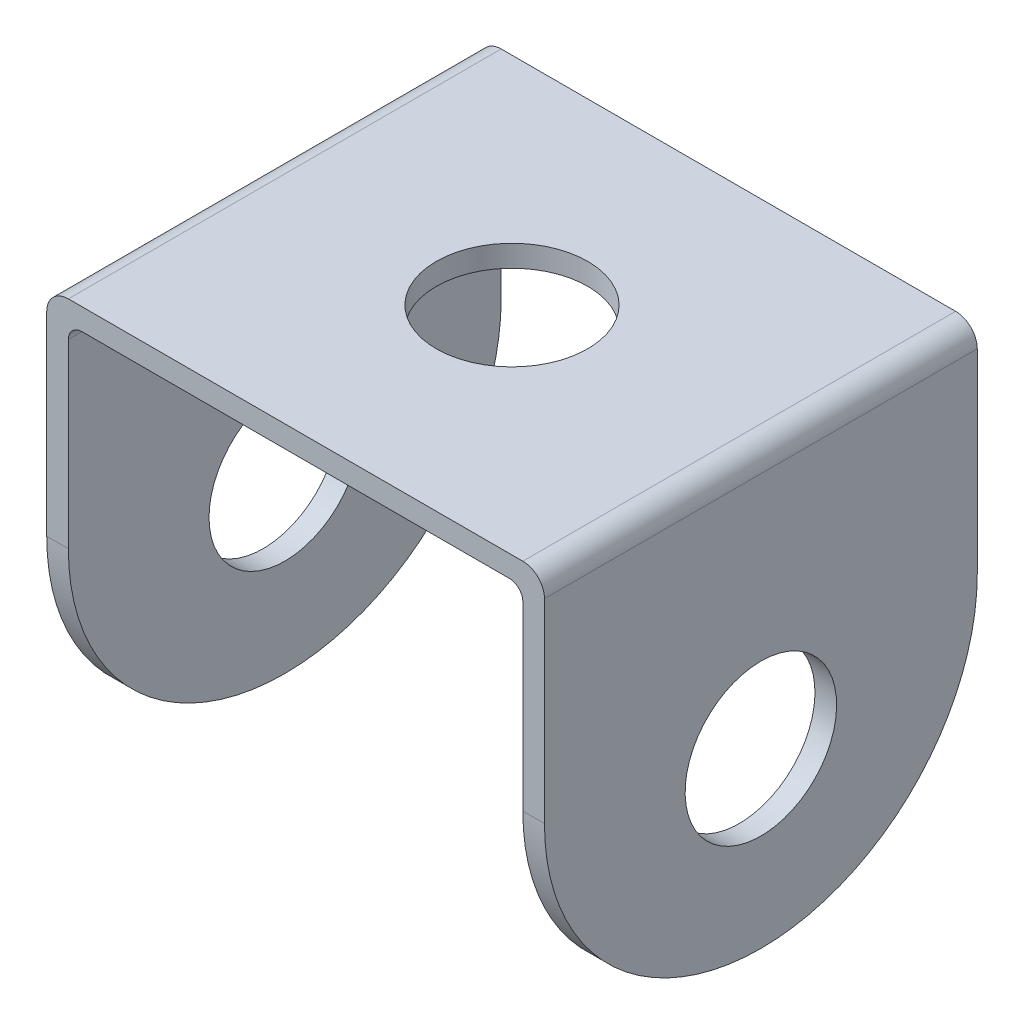
ISO-10303-21;
HEADER;
FILE_DESCRIPTION(('STEP AP214'),'2;1');
FILE_NAME('part.step','',(''),(''),'','','');
FILE_SCHEMA(('AUTOMOTIVE_DESIGN { 1 0 10303 214 1 1 1 1 }'));
ENDSEC;
DATA;
#1=APPLICATION_CONTEXT('core data for automotive mechanical design processes');
#2=APPLICATION_PROTOCOL_DEFINITION('international standard','automotive_design',2000,#1);
#3=PRODUCT_CONTEXT('',#1,'mechanical');
#4=PRODUCT('Part','Part','',(#3));
#5=PRODUCT_RELATED_PRODUCT_CATEGORY('part','',(#4));
#6=PRODUCT_DEFINITION_FORMATION('','',#4);
#7=PRODUCT_DEFINITION_CONTEXT('part definition',#1,'design');
#8=PRODUCT_DEFINITION('design','',#6,#7);
#9=PRODUCT_DEFINITION_SHAPE('','',#8);
#10=(LENGTH_UNIT() NAMED_UNIT(*) SI_UNIT(.MILLI.,.METRE.));
#11=(NAMED_UNIT(*) PLANE_ANGLE_UNIT() SI_UNIT($,.RADIAN.));
#12=(NAMED_UNIT(*) SI_UNIT($,.STERADIAN.) SOLID_ANGLE_UNIT());
#13=UNCERTAINTY_MEASURE_WITH_UNIT(LENGTH_MEASURE(1.E-05),#10,'distance_accuracy_value','');
#14=(GEOMETRIC_REPRESENTATION_CONTEXT(3) GLOBAL_UNCERTAINTY_ASSIGNED_CONTEXT((#13)) GLOBAL_UNIT_ASSIGNED_CONTEXT((#10,
#11,#12)) REPRESENTATION_CONTEXT('',''));
#15=CARTESIAN_POINT('',(0.,0.,0.));
#16=DIRECTION('',(0.,0.,1.));
#17=DIRECTION('',(1.,0.,0.));
#18=AXIS2_PLACEMENT_3D('',#15,#16,#17);
#19=CARTESIAN_POINT('',(20.3073,15.24,6.34999999999999));
#20=DIRECTION('',(0.,-1.,0.));
#21=DIRECTION('',(-1.,0.,0.));
#22=AXIS2_PLACEMENT_3D('',#19,#20,#21);
#23=CYLINDRICAL_SURFACE('',#22,2.2225);
#24=CARTESIAN_POINT('',(20.3073,14.605,6.34999999999999));
#25=DIRECTION('',(0.,1.,0.));
#26=DIRECTION('',(1.,0.,0.));
#27=AXIS2_PLACEMENT_3D('',#24,#25,#26);
#28=CIRCLE('',#27,2.2225);
#29=CARTESIAN_POINT('',(18.0848,14.605,6.34999999999999));
#30=VERTEX_POINT('',#29);
#31=EDGE_CURVE('E217',#30,#30,#28,.T.);
#32=CARTESIAN_POINT('',(20.3073,15.24,6.34999999999999));
#33=DIRECTION('',(0.,-1.,0.));
#34=DIRECTION('',(-1.,0.,0.));
#35=AXIS2_PLACEMENT_3D('',#32,#33,#34);
#36=CIRCLE('',#35,2.2225);
#37=CARTESIAN_POINT('',(18.0848,15.24,6.34999999999999));
#38=VERTEX_POINT('',#37);
#39=EDGE_CURVE('E142',#38,#38,#36,.T.);
#40=CARTESIAN_POINT('',(18.0848,14.605,6.34999999999999));
#41=CARTESIAN_POINT('',(18.0848,14.6116145833334,6.34999999999999));
#42=CARTESIAN_POINT('',(18.0848,14.6182291666667,6.34999999999999));
#43=CARTESIAN_POINT('',(18.0848,14.6314583333334,6.34999999999999));
#44=CARTESIAN_POINT('',(18.0848,14.6380729166667,6.34999999999999));
#45=CARTESIAN_POINT('',(18.0848,14.6513020833334,6.34999999999999));
#46=CARTESIAN_POINT('',(18.0848,14.6579166666667,6.34999999999999));
#47=CARTESIAN_POINT('',(18.0848,14.6711458333334,6.34999999999999));
#48=CARTESIAN_POINT('',(18.0848,14.6777604166667,6.34999999999999));
#49=CARTESIAN_POINT('',(18.0848,14.6909895833334,6.34999999999999));
#50=CARTESIAN_POINT('',(18.0848,14.6976041666667,6.34999999999999));
#51=CARTESIAN_POINT('',(18.0848,14.7108333333334,6.34999999999999));
#52=CARTESIAN_POINT('',(18.0848,14.7174479166667,6.34999999999999));
#53=CARTESIAN_POINT('',(18.0848,14.7306770833334,6.34999999999999));
#54=CARTESIAN_POINT('',(18.0848,14.7372916666667,6.34999999999999));
#55=CARTESIAN_POINT('',(18.0848,14.7505208333334,6.34999999999999));
#56=CARTESIAN_POINT('',(18.0848,14.7571354166667,6.34999999999999));
#57=CARTESIAN_POINT('',(18.0848,14.7703645833334,6.34999999999999));
#58=CARTESIAN_POINT('',(18.0848,14.7769791666667,6.34999999999999));
#59=CARTESIAN_POINT('',(18.0848,14.7902083333334,6.34999999999999));
#60=CARTESIAN_POINT('',(18.0848,14.7968229166667,6.34999999999999));
#61=CARTESIAN_POINT('',(18.0848,14.8100520833334,6.34999999999999));
#62=CARTESIAN_POINT('',(18.0848,14.8166666666667,6.34999999999999));
#63=CARTESIAN_POINT('',(18.0848,14.8298958333334,6.34999999999999));
#64=CARTESIAN_POINT('',(18.0848,14.8365104166667,6.34999999999999));
#65=CARTESIAN_POINT('',(18.0848,14.8497395833334,6.34999999999999));
#66=CARTESIAN_POINT('',(18.0848,14.8563541666667,6.34999999999999));
#67=CARTESIAN_POINT('',(18.0848,14.8695833333334,6.34999999999999));
#68=CARTESIAN_POINT('',(18.0848,14.8761979166667,6.34999999999999));
#69=CARTESIAN_POINT('',(18.0848,14.8894270833334,6.34999999999999));
#70=CARTESIAN_POINT('',(18.0848,14.8960416666667,6.34999999999999));
#71=CARTESIAN_POINT('',(18.0848,14.9092708333334,6.34999999999999));
#72=CARTESIAN_POINT('',(18.0848,14.9158854166667,6.34999999999999));
#73=CARTESIAN_POINT('',(18.0848,14.9291145833334,6.34999999999999));
#74=CARTESIAN_POINT('',(18.0848,14.9357291666667,6.34999999999999));
#75=CARTESIAN_POINT('',(18.0848,14.9489583333334,6.34999999999999));
#76=CARTESIAN_POINT('',(18.0848,14.9555729166667,6.34999999999999));
#77=CARTESIAN_POINT('',(18.0848,14.9688020833334,6.34999999999999));
#78=CARTESIAN_POINT('',(18.0848,14.9754166666667,6.34999999999999));
#79=CARTESIAN_POINT('',(18.0848,14.9886458333334,6.34999999999999));
#80=CARTESIAN_POINT('',(18.0848,14.9952604166667,6.34999999999999));
#81=CARTESIAN_POINT('',(18.0848,15.0084895833334,6.34999999999999));
#82=CARTESIAN_POINT('',(18.0848,15.0151041666667,6.34999999999999));
#83=CARTESIAN_POINT('',(18.0848,15.0283333333334,6.34999999999999));
#84=CARTESIAN_POINT('',(18.0848,15.0349479166667,6.34999999999999));
#85=CARTESIAN_POINT('',(18.0848,15.0481770833334,6.34999999999999));
#86=CARTESIAN_POINT('',(18.0848,15.0547916666667,6.34999999999999));
#87=CARTESIAN_POINT('',(18.0848,15.0680208333334,6.34999999999999));
#88=CARTESIAN_POINT('',(18.0848,15.0746354166667,6.34999999999999));
#89=CARTESIAN_POINT('',(18.0848,15.0878645833334,6.34999999999999));
#90=CARTESIAN_POINT('',(18.0848,15.0944791666667,6.34999999999999));
#91=CARTESIAN_POINT('',(18.0848,15.1077083333334,6.34999999999999));
#92=CARTESIAN_POINT('',(18.0848,15.1143229166667,6.34999999999999));
#93=CARTESIAN_POINT('',(18.0848,15.1275520833334,6.34999999999999));
#94=CARTESIAN_POINT('',(18.0848,15.1341666666667,6.34999999999999));
#95=CARTESIAN_POINT('',(18.0848,15.1473958333334,6.34999999999999));
#96=CARTESIAN_POINT('',(18.0848,15.1540104166667,6.34999999999999));
#97=CARTESIAN_POINT('',(18.0848,15.1672395833334,6.34999999999999));
#98=CARTESIAN_POINT('',(18.0848,15.1738541666667,6.34999999999999));
#99=CARTESIAN_POINT('',(18.0848,15.1870833333334,6.34999999999999));
#100=CARTESIAN_POINT('',(18.0848,15.1936979166667,6.34999999999999));
#101=CARTESIAN_POINT('',(18.0848,15.2069270833334,6.34999999999999));
#102=CARTESIAN_POINT('',(18.0848,15.2135416666667,6.34999999999999));
#103=CARTESIAN_POINT('',(18.0848,15.2267708333334,6.34999999999999));
#104=CARTESIAN_POINT('',(18.0848,15.2333854166667,6.34999999999999));
#105=CARTESIAN_POINT('',(18.0848,15.24,6.34999999999999));
#106=B_SPLINE_CURVE_WITH_KNOTS('',3,(#40,#41,#42,#43,#44,#45,#46,#47,#48,#49,#50,#51,#52,#53,
#54,#55,#56,#57,#58,#59,#60,#61,#62,#63,#64,#65,#66,#67,#68,#69,#70,#71,#72,#73,#74,#75,#76,#77,
#78,#79,#80,#81,#82,#83,#84,#85,#86,#87,#88,#89,#90,#91,#92,#93,#94,#95,#96,#97,#98,#99,#100,
#101,#102,#103,#104,#105),.UNSPECIFIED.,.F.,.F.,(4,2,2,2,2,2,2,2,2,2,2,2,2,2,2,2,2,2,2,2,2,2,2,
2,2,2,2,2,2,2,2,2,4),(0.,0.0198437499999999,0.0396875000000015,0.0595312500000014,
0.0793750000000013,0.0992187500000012,0.119062500000001,0.138906250000001,0.158750000000001,
0.178593750000001,0.198437500000001,0.218281250000001,0.238125,0.25796875,0.2778125,0.29765625,
0.3175,0.33734375,0.3571875,0.37703125,0.396875,0.41671875,0.436562499999999,0.456406249999999,
0.476249999999999,0.496093749999999,0.515937499999999,0.535781249999999,0.555624999999999,
0.575468749999999,0.595312499999999,0.615156249999999,0.634999999999998),.UNSPECIFIED.);
#107=EDGE_CURVE('BSEAM16',#30,#38,#106,.T.);
#108=ORIENTED_EDGE('',*,*,#31,.F.);
#109=ORIENTED_EDGE('',*,*,#39,.F.);
#110=ORIENTED_EDGE('',*,*,#107,.T.);
#111=ORIENTED_EDGE('',*,*,#107,.F.);
#112=EDGE_LOOP('',(#108,#110,#109,#111));
#113=FACE_BOUND('',#112,.T.);
#114=ADVANCED_FACE('F16',(#113),#23,.F.);
#115=CARTESIAN_POINT('',(27.6098,8.89,6.34999999999999));
#116=DIRECTION('',(-1.,0.,0.));
#117=DIRECTION('',(0.,1.,0.));
#118=AXIS2_PLACEMENT_3D('',#115,#116,#117);
#119=CYLINDRICAL_SURFACE('',#118,6.35);
#120=CARTESIAN_POINT('',(13.6398,8.89000000000002,6.34999999999999));
#121=DIRECTION('',(1.,0.,0.));
#122=DIRECTION('',(0.,1.,0.));
#123=AXIS2_PLACEMENT_3D('',#120,#121,#122);
#124=CIRCLE('',#123,6.35);
#125=CARTESIAN_POINT('',(13.6398,8.89,12.7));
#126=VERTEX_POINT('',#125);
#127=CARTESIAN_POINT('',(13.6398,8.89000000000001,0.));
#128=VERTEX_POINT('',#127);
#129=EDGE_CURVE('E35',#126,#128,#124,.T.);
#130=ORIENTED_EDGE('',*,*,#129,.F.);
#131=DIRECTION('',(1.,0.,0.));
#132=VECTOR('',#131,1.);
#133=CARTESIAN_POINT('',(27.6098,8.89000000000002,12.7));
#134=LINE('',#133,#132);
#135=CARTESIAN_POINT('',(13.0048,8.89,12.7));
#136=VERTEX_POINT('',#135);
#137=EDGE_CURVE('E144',#136,#126,#134,.T.);
#138=ORIENTED_EDGE('',*,*,#137,.F.);
#139=CARTESIAN_POINT('',(13.0048,8.89000000000001,6.34999999999999));
#140=DIRECTION('',(-1.,0.,0.));
#141=DIRECTION('',(0.,0.,1.));
#142=AXIS2_PLACEMENT_3D('',#139,#140,#141);
#143=CIRCLE('',#142,6.35);
#144=CARTESIAN_POINT('',(13.0048,8.89,0.));
#145=VERTEX_POINT('',#144);
#146=EDGE_CURVE('E149',#145,#136,#143,.T.);
#147=ORIENTED_EDGE('',*,*,#146,.F.);
#148=DIRECTION('',(1.,0.,0.));
#149=VECTOR('',#148,1.);
#150=CARTESIAN_POINT('',(27.6098,8.89,0.));
#151=LINE('',#150,#149);
#152=EDGE_CURVE('E11',#145,#128,#151,.T.);
#153=ORIENTED_EDGE('',*,*,#152,.T.);
#154=EDGE_LOOP('',(#130,#138,#147,#153));
#155=FACE_BOUND('',#154,.T.);
#156=ADVANCED_FACE('F282',(#155),#119,.T.);
#157=CARTESIAN_POINT('',(27.6098,8.89,6.34999999999999));
#158=DIRECTION('',(-1.,0.,0.));
#159=DIRECTION('',(0.,1.,0.));
#160=AXIS2_PLACEMENT_3D('',#157,#158,#159);
#161=CYLINDRICAL_SURFACE('',#160,6.35);
#162=CARTESIAN_POINT('',(26.9748,8.89000000000001,6.34999999999999));
#163=DIRECTION('',(-1.,0.,0.));
#164=DIRECTION('',(0.,1.,0.));
#165=AXIS2_PLACEMENT_3D('',#162,#163,#164);
#166=CIRCLE('',#165,6.35);
#167=CARTESIAN_POINT('',(26.9748,8.89,0.));
#168=VERTEX_POINT('',#167);
#169=CARTESIAN_POINT('',(26.9748,8.89000000000001,12.7));
#170=VERTEX_POINT('',#169);
#171=EDGE_CURVE('E153',#168,#170,#166,.T.);
#172=ORIENTED_EDGE('',*,*,#171,.F.);
#173=DIRECTION('',(1.,0.,0.));
#174=VECTOR('',#173,1.);
#175=CARTESIAN_POINT('',(27.6098,8.89,0.));
#176=LINE('',#175,#174);
#177=CARTESIAN_POINT('',(27.6098,8.89,0.));
#178=VERTEX_POINT('',#177);
#179=EDGE_CURVE('E27',#168,#178,#176,.T.);
#180=ORIENTED_EDGE('',*,*,#179,.T.);
#181=CARTESIAN_POINT('',(27.6098,8.89,6.34999999999999));
#182=DIRECTION('',(1.,0.,0.));
#183=DIRECTION('',(0.,1.,0.));
#184=AXIS2_PLACEMENT_3D('',#181,#182,#183);
#185=CIRCLE('',#184,6.35);
#186=CARTESIAN_POINT('',(27.6098,8.89000000000002,12.7));
#187=VERTEX_POINT('',#186);
#188=EDGE_CURVE('E161',#187,#178,#185,.T.);
#189=ORIENTED_EDGE('',*,*,#188,.F.);
#190=DIRECTION('',(1.,0.,0.));
#191=VECTOR('',#190,1.);
#192=CARTESIAN_POINT('',(27.6098,8.89000000000002,12.7));
#193=LINE('',#192,#191);
#194=EDGE_CURVE('E147',#170,#187,#193,.T.);
#195=ORIENTED_EDGE('',*,*,#194,.F.);
#196=EDGE_LOOP('',(#172,#180,#189,#195));
#197=FACE_BOUND('',#196,.T.);
#198=ADVANCED_FACE('F298',(#197),#161,.T.);
#199=CARTESIAN_POINT('',(27.6098,7.62000000000002,6.34999999999999));
#200=DIRECTION('',(-1.,0.,0.));
#201=DIRECTION('',(0.,1.,0.));
#202=AXIS2_PLACEMENT_3D('',#199,#200,#201);
#203=CYLINDRICAL_SURFACE('',#202,2.2225);
#204=CARTESIAN_POINT('',(13.6398,7.61999999999999,6.34999999999999));
#205=DIRECTION('',(-1.,0.,0.));
#206=DIRECTION('',(0.,0.,1.));
#207=AXIS2_PLACEMENT_3D('',#204,#205,#206);
#208=CIRCLE('',#207,2.2225);
#209=CARTESIAN_POINT('',(13.6398,7.61999999999999,8.57249999999999));
#210=VERTEX_POINT('',#209);
#211=EDGE_CURVE('E169',#210,#210,#208,.T.);
#212=ORIENTED_EDGE('',*,*,#211,.F.);
#213=EDGE_LOOP('',(#212));
#214=FACE_BOUND('',#213,.T.);
#215=CARTESIAN_POINT('',(13.0048,7.62,6.34999999999999));
#216=DIRECTION('',(1.,0.,0.));
#217=DIRECTION('',(0.,0.,1.));
#218=AXIS2_PLACEMENT_3D('',#215,#216,#217);
#219=CIRCLE('',#218,2.2225);
#220=CARTESIAN_POINT('',(13.0048,7.62,8.57249999999999));
#221=VERTEX_POINT('',#220);
#222=EDGE_CURVE('E148',#221,#221,#219,.T.);
#223=ORIENTED_EDGE('',*,*,#222,.F.);
#224=EDGE_LOOP('',(#223));
#225=FACE_BOUND('',#224,.T.);
#226=ADVANCED_FACE('F18',(#214,#225),#203,.F.);
#227=CARTESIAN_POINT('',(27.6098,7.62000000000002,6.34999999999999));
#228=DIRECTION('',(-1.,0.,0.));
#229=DIRECTION('',(0.,1.,0.));
#230=AXIS2_PLACEMENT_3D('',#227,#228,#229);
#231=CYLINDRICAL_SURFACE('',#230,2.2225);
#232=CARTESIAN_POINT('',(26.9748,7.62,6.34999999999999));
#233=DIRECTION('',(1.,0.,0.));
#234=DIRECTION('',(0.,1.,0.));
#235=AXIS2_PLACEMENT_3D('',#232,#233,#234);
#236=CIRCLE('',#235,2.2225);
#237=CARTESIAN_POINT('',(26.9748,9.8425,6.34999999999999));
#238=VERTEX_POINT('',#237);
#239=EDGE_CURVE('E176',#238,#238,#236,.T.);
#240=ORIENTED_EDGE('',*,*,#239,.F.);
#241=EDGE_LOOP('',(#240));
#242=FACE_BOUND('',#241,.T.);
#243=CARTESIAN_POINT('',(27.6098,7.62000000000002,6.34999999999999));
#244=DIRECTION('',(-1.,0.,0.));
#245=DIRECTION('',(0.,1.,0.));
#246=AXIS2_PLACEMENT_3D('',#243,#244,#245);
#247=CIRCLE('',#246,2.2225);
#248=CARTESIAN_POINT('',(27.6098,9.84250000000001,6.34999999999999));
#249=VERTEX_POINT('',#248);
#250=EDGE_CURVE('E164',#249,#249,#247,.T.);
#251=ORIENTED_EDGE('',*,*,#250,.F.);
#252=EDGE_LOOP('',(#251));
#253=FACE_BOUND('',#252,.T.);
#254=ADVANCED_FACE('F306',(#242,#253),#231,.F.);
#255=CARTESIAN_POINT('',(20.3073,10.7873127668743,12.7));
#256=DIRECTION('',(0.,0.,1.));
#257=DIRECTION('',(1.,0.,0.));
#258=AXIS2_PLACEMENT_3D('',#255,#256,#257);
#259=PLANE('',#258);
#260=ORIENTED_EDGE('',*,*,#194,.T.);
#261=DIRECTION('',(0.,-1.,0.));
#262=VECTOR('',#261,1.);
#263=CARTESIAN_POINT('',(27.6098,2.54000000000001,12.7));
#264=LINE('',#263,#262);
#265=CARTESIAN_POINT('',(27.6098,14.605,12.7));
#266=VERTEX_POINT('',#265);
#267=EDGE_CURVE('E186',#266,#187,#264,.T.);
#268=ORIENTED_EDGE('',*,*,#267,.F.);
#269=CARTESIAN_POINT('',(26.9748,14.605,12.7));
#270=DIRECTION('',(0.,0.,-1.));
#271=DIRECTION('',(0.,-1.,0.));
#272=AXIS2_PLACEMENT_3D('',#269,#270,#271);
#273=CIRCLE('',#272,0.635);
#274=CARTESIAN_POINT('',(26.9748,15.24,12.7));
#275=VERTEX_POINT('',#274);
#276=EDGE_CURVE('E192',#275,#266,#273,.T.);
#277=ORIENTED_EDGE('',*,*,#276,.F.);
#278=DIRECTION('',(1.,0.,0.));
#279=VECTOR('',#278,1.);
#280=CARTESIAN_POINT('',(26.9748,15.24,12.7));
#281=LINE('',#280,#279);
#282=CARTESIAN_POINT('',(13.6398,15.24,12.7));
#283=VERTEX_POINT('',#282);
#284=EDGE_CURVE('E197',#283,#275,#281,.T.);
#285=ORIENTED_EDGE('',*,*,#284,.F.);
#286=CARTESIAN_POINT('',(13.6398,14.605,12.7));
#287=DIRECTION('',(0.,0.,-1.));
#288=DIRECTION('',(0.,-1.,0.));
#289=AXIS2_PLACEMENT_3D('',#286,#287,#288);
#290=CIRCLE('',#289,0.635);
#291=CARTESIAN_POINT('',(13.0048,14.605,12.7));
#292=VERTEX_POINT('',#291);
#293=EDGE_CURVE('E191',#292,#283,#290,.T.);
#294=ORIENTED_EDGE('',*,*,#293,.F.);
#295=DIRECTION('',(0.,1.,0.));
#296=VECTOR('',#295,1.);
#297=CARTESIAN_POINT('',(13.0048,14.605,12.7));
#298=LINE('',#297,#296);
#299=EDGE_CURVE('E151',#136,#292,#298,.T.);
#300=ORIENTED_EDGE('',*,*,#299,.F.);
#301=ORIENTED_EDGE('',*,*,#137,.T.);
#302=DIRECTION('',(0.,-1.,0.));
#303=VECTOR('',#302,1.);
#304=CARTESIAN_POINT('',(13.6398,2.54000000000003,12.7));
#305=LINE('',#304,#303);
#306=CARTESIAN_POINT('',(13.6398,14.208125,12.7));
#307=VERTEX_POINT('',#306);
#308=EDGE_CURVE('E120',#307,#126,#305,.T.);
#309=ORIENTED_EDGE('',*,*,#308,.F.);
#310=CARTESIAN_POINT('',(14.036675,14.208125,12.7));
#311=DIRECTION('',(0.,0.,1.));
#312=DIRECTION('',(1.,0.,0.));
#313=AXIS2_PLACEMENT_3D('',#310,#311,#312);
#314=CIRCLE('',#313,0.396875000000008);
#315=CARTESIAN_POINT('',(14.036675,14.605,12.7));
#316=VERTEX_POINT('',#315);
#317=EDGE_CURVE('E115',#316,#307,#314,.T.);
#318=ORIENTED_EDGE('',*,*,#317,.F.);
#319=DIRECTION('',(-1.,0.,0.));
#320=VECTOR('',#319,1.);
#321=CARTESIAN_POINT('',(14.036675,14.605,12.7));
#322=LINE('',#321,#320);
#323=CARTESIAN_POINT('',(26.577925,14.605,12.7));
#324=VERTEX_POINT('',#323);
#325=EDGE_CURVE('E214',#324,#316,#322,.T.);
#326=ORIENTED_EDGE('',*,*,#325,.F.);
#327=CARTESIAN_POINT('',(26.577925,14.208125,12.7));
#328=DIRECTION('',(0.,0.,1.));
#329=DIRECTION('',(1.,0.,0.));
#330=AXIS2_PLACEMENT_3D('',#327,#328,#329);
#331=CIRCLE('',#330,0.396875000000003);
#332=CARTESIAN_POINT('',(26.9748,14.208125,12.7));
#333=VERTEX_POINT('',#332);
#334=EDGE_CURVE('E181',#333,#324,#331,.T.);
#335=ORIENTED_EDGE('',*,*,#334,.F.);
#336=DIRECTION('',(0.,1.,0.));
#337=VECTOR('',#336,1.);
#338=CARTESIAN_POINT('',(26.9748,14.208125,12.7));
#339=LINE('',#338,#337);
#340=EDGE_CURVE('E157',#170,#333,#339,.T.);
#341=ORIENTED_EDGE('',*,*,#340,.F.);
#342=EDGE_LOOP('',(#260,#268,#277,#285,#294,#300,#301,#309,#318,#326,#335,#341));
#343=FACE_BOUND('',#342,.T.);
#344=ADVANCED_FACE('F279',(#343),#259,.T.);
#345=CARTESIAN_POINT('',(13.0048,2.54,0.));
#346=DIRECTION('',(-1.,0.,0.));
#347=DIRECTION('',(0.,-1.,0.));
#348=AXIS2_PLACEMENT_3D('',#345,#346,#347);
#349=PLANE('',#348);
#350=ORIENTED_EDGE('',*,*,#222,.T.);
#351=EDGE_LOOP('',(#350));
#352=FACE_BOUND('',#351,.T.);
#353=ORIENTED_EDGE('',*,*,#146,.T.);
#354=ORIENTED_EDGE('',*,*,#299,.T.);
#355=DIRECTION('',(0.,0.,1.));
#356=VECTOR('',#355,1.);
#357=CARTESIAN_POINT('',(13.0048,14.605,0.));
#358=LINE('',#357,#356);
#359=CARTESIAN_POINT('',(13.0048,14.605,0.));
#360=VERTEX_POINT('',#359);
#361=EDGE_CURVE('E225',#360,#292,#358,.T.);
#362=ORIENTED_EDGE('',*,*,#361,.F.);
#363=DIRECTION('',(0.,-1.,0.));
#364=VECTOR('',#363,1.);
#365=CARTESIAN_POINT('',(13.0048,14.605,0.));
#366=LINE('',#365,#364);
#367=EDGE_CURVE('E185',#360,#145,#366,.T.);
#368=ORIENTED_EDGE('',*,*,#367,.T.);
#369=EDGE_LOOP('',(#353,#354,#362,#368));
#370=FACE_BOUND('',#369,.T.);
#371=ADVANCED_FACE('F286',(#352,#370),#349,.T.);
#372=CARTESIAN_POINT('',(27.6098,14.605,0.));
#373=DIRECTION('',(1.,0.,0.));
#374=DIRECTION('',(0.,1.,0.));
#375=AXIS2_PLACEMENT_3D('',#372,#373,#374);
#376=PLANE('',#375);
#377=ORIENTED_EDGE('',*,*,#250,.T.);
#378=EDGE_LOOP('',(#377));
#379=FACE_BOUND('',#378,.T.);
#380=ORIENTED_EDGE('',*,*,#188,.T.);
#381=DIRECTION('',(0.,1.,0.));
#382=VECTOR('',#381,1.);
#383=CARTESIAN_POINT('',(27.6098,2.54,0.));
#384=LINE('',#383,#382);
#385=CARTESIAN_POINT('',(27.6098,14.605,0.));
#386=VERTEX_POINT('',#385);
#387=EDGE_CURVE('E165',#178,#386,#384,.T.);
#388=ORIENTED_EDGE('',*,*,#387,.T.);
#389=DIRECTION('',(0.,0.,1.));
#390=VECTOR('',#389,1.);
#391=CARTESIAN_POINT('',(27.6098,14.605,0.));
#392=LINE('',#391,#390);
#393=EDGE_CURVE('E190',#386,#266,#392,.T.);
#394=ORIENTED_EDGE('',*,*,#393,.T.);
#395=ORIENTED_EDGE('',*,*,#267,.T.);
#396=EDGE_LOOP('',(#380,#388,#394,#395));
#397=FACE_BOUND('',#396,.T.);
#398=ADVANCED_FACE('F296',(#379,#397),#376,.T.);
#399=CARTESIAN_POINT('',(13.6398,14.605,0.));
#400=DIRECTION('',(0.,0.,1.));
#401=DIRECTION('',(1.,0.,0.));
#402=AXIS2_PLACEMENT_3D('',#399,#400,#401);
#403=CYLINDRICAL_SURFACE('',#402,0.635);
#404=ORIENTED_EDGE('',*,*,#293,.T.);
#405=DIRECTION('',(0.,0.,1.));
#406=VECTOR('',#405,1.);
#407=CARTESIAN_POINT('',(13.6398,15.24,0.));
#408=LINE('',#407,#406);
#409=CARTESIAN_POINT('',(13.6398,15.24,0.));
#410=VERTEX_POINT('',#409);
#411=EDGE_CURVE('E195',#410,#283,#408,.T.);
#412=ORIENTED_EDGE('',*,*,#411,.F.);
#413=CARTESIAN_POINT('',(13.6398,14.605,0.));
#414=DIRECTION('',(0.,0.,1.));
#415=DIRECTION('',(1.,0.,0.));
#416=AXIS2_PLACEMENT_3D('',#413,#414,#415);
#417=CIRCLE('',#416,0.635);
#418=EDGE_CURVE('E205',#410,#360,#417,.T.);
#419=ORIENTED_EDGE('',*,*,#418,.T.);
#420=ORIENTED_EDGE('',*,*,#361,.T.);
#421=EDGE_LOOP('',(#404,#412,#419,#420));
#422=FACE_BOUND('',#421,.T.);
#423=ADVANCED_FACE('F288',(#422),#403,.T.);
#424=CARTESIAN_POINT('',(13.6398,15.24,0.));
#425=DIRECTION('',(0.,1.,0.));
#426=DIRECTION('',(-1.,0.,0.));
#427=AXIS2_PLACEMENT_3D('',#424,#425,#426);
#428=PLANE('',#427);
#429=ORIENTED_EDGE('',*,*,#39,.T.);
#430=EDGE_LOOP('',(#429));
#431=FACE_BOUND('',#430,.T.);
#432=ORIENTED_EDGE('',*,*,#284,.T.);
#433=DIRECTION('',(0.,0.,1.));
#434=VECTOR('',#433,1.);
#435=CARTESIAN_POINT('',(26.9748,15.24,0.));
#436=LINE('',#435,#434);
#437=CARTESIAN_POINT('',(26.9748,15.24,0.));
#438=VERTEX_POINT('',#437);
#439=EDGE_CURVE('E156',#438,#275,#436,.T.);
#440=ORIENTED_EDGE('',*,*,#439,.F.);
#441=DIRECTION('',(-1.,0.,0.));
#442=VECTOR('',#441,1.);
#443=CARTESIAN_POINT('',(26.9748,15.24,0.));
#444=LINE('',#443,#442);
#445=EDGE_CURVE('E201',#438,#410,#444,.T.);
#446=ORIENTED_EDGE('',*,*,#445,.T.);
#447=ORIENTED_EDGE('',*,*,#411,.T.);
#448=EDGE_LOOP('',(#432,#440,#446,#447));
#449=FACE_BOUND('',#448,.T.);
#450=ADVANCED_FACE('F292',(#431,#449),#428,.T.);
#451=CARTESIAN_POINT('',(26.9748,14.605,0.));
#452=DIRECTION('',(0.,0.,1.));
#453=DIRECTION('',(1.,0.,0.));
#454=AXIS2_PLACEMENT_3D('',#451,#452,#453);
#455=CYLINDRICAL_SURFACE('',#454,0.635);
#456=ORIENTED_EDGE('',*,*,#276,.T.);
#457=ORIENTED_EDGE('',*,*,#393,.F.);
#458=CARTESIAN_POINT('',(26.9748,14.605,0.));
#459=DIRECTION('',(0.,0.,1.));
#460=DIRECTION('',(1.,0.,0.));
#461=AXIS2_PLACEMENT_3D('',#458,#459,#460);
#462=CIRCLE('',#461,0.635);
#463=EDGE_CURVE('E196',#386,#438,#462,.T.);
#464=ORIENTED_EDGE('',*,*,#463,.T.);
#465=ORIENTED_EDGE('',*,*,#439,.T.);
#466=EDGE_LOOP('',(#456,#457,#464,#465));
#467=FACE_BOUND('',#466,.T.);
#468=ADVANCED_FACE('F294',(#467),#455,.T.);
#469=CARTESIAN_POINT('',(26.9748,2.54,0.));
#470=DIRECTION('',(-1.,0.,0.));
#471=DIRECTION('',(0.,-1.,0.));
#472=AXIS2_PLACEMENT_3D('',#469,#470,#471);
#473=PLANE('',#472);
#474=ORIENTED_EDGE('',*,*,#171,.T.);
#475=ORIENTED_EDGE('',*,*,#340,.T.);
#476=DIRECTION('',(0.,0.,1.));
#477=VECTOR('',#476,1.);
#478=CARTESIAN_POINT('',(26.9748,14.208125,0.));
#479=LINE('',#478,#477);
#480=CARTESIAN_POINT('',(26.9748,14.208125,0.));
#481=VERTEX_POINT('',#480);
#482=EDGE_CURVE('E253',#481,#333,#479,.T.);
#483=ORIENTED_EDGE('',*,*,#482,.F.);
#484=DIRECTION('',(0.,-1.,0.));
#485=VECTOR('',#484,1.);
#486=CARTESIAN_POINT('',(26.9748,14.208125,0.));
#487=LINE('',#486,#485);
#488=EDGE_CURVE('E180',#481,#168,#487,.T.);
#489=ORIENTED_EDGE('',*,*,#488,.T.);
#490=EDGE_LOOP('',(#474,#475,#483,#489));
#491=FACE_BOUND('',#490,.T.);
#492=ORIENTED_EDGE('',*,*,#239,.T.);
#493=EDGE_LOOP('',(#492));
#494=FACE_BOUND('',#493,.T.);
#495=ADVANCED_FACE('F274',(#491,#494),#473,.T.);
#496=CARTESIAN_POINT('',(26.577925,14.208125,0.));
#497=DIRECTION('',(0.,0.,1.));
#498=DIRECTION('',(1.,0.,0.));
#499=AXIS2_PLACEMENT_3D('',#496,#497,#498);
#500=CYLINDRICAL_SURFACE('',#499,0.396875000000003);
#501=ORIENTED_EDGE('',*,*,#334,.T.);
#502=DIRECTION('',(0.,0.,1.));
#503=VECTOR('',#502,1.);
#504=CARTESIAN_POINT('',(26.577925,14.605,0.));
#505=LINE('',#504,#503);
#506=CARTESIAN_POINT('',(26.577925,14.605,0.));
#507=VERTEX_POINT('',#506);
#508=EDGE_CURVE('E213',#507,#324,#505,.T.);
#509=ORIENTED_EDGE('',*,*,#508,.F.);
#510=CARTESIAN_POINT('',(26.577925,14.208125,0.));
#511=DIRECTION('',(0.,0.,-1.));
#512=DIRECTION('',(0.,-1.,0.));
#513=AXIS2_PLACEMENT_3D('',#510,#511,#512);
#514=CIRCLE('',#513,0.396875000000003);
#515=EDGE_CURVE('E221',#507,#481,#514,.T.);
#516=ORIENTED_EDGE('',*,*,#515,.T.);
#517=ORIENTED_EDGE('',*,*,#482,.T.);
#518=EDGE_LOOP('',(#501,#509,#516,#517));
#519=FACE_BOUND('',#518,.T.);
#520=ADVANCED_FACE('F270',(#519),#500,.F.);
#521=CARTESIAN_POINT('',(26.577925,14.605,0.));
#522=DIRECTION('',(0.,-1.,0.));
#523=DIRECTION('',(1.,0.,0.));
#524=AXIS2_PLACEMENT_3D('',#521,#522,#523);
#525=PLANE('',#524);
#526=ORIENTED_EDGE('',*,*,#31,.T.);
#527=EDGE_LOOP('',(#526));
#528=FACE_BOUND('',#527,.T.);
#529=ORIENTED_EDGE('',*,*,#325,.T.);
#530=DIRECTION('',(0.,0.,1.));
#531=VECTOR('',#530,1.);
#532=CARTESIAN_POINT('',(14.036675,14.605,0.));
#533=LINE('',#532,#531);
#534=CARTESIAN_POINT('',(14.036675,14.605,0.));
#535=VERTEX_POINT('',#534);
#536=EDGE_CURVE('E104',#535,#316,#533,.T.);
#537=ORIENTED_EDGE('',*,*,#536,.F.);
#538=DIRECTION('',(1.,0.,0.));
#539=VECTOR('',#538,1.);
#540=CARTESIAN_POINT('',(14.036675,14.605,0.));
#541=LINE('',#540,#539);
#542=EDGE_CURVE('E128',#535,#507,#541,.T.);
#543=ORIENTED_EDGE('',*,*,#542,.T.);
#544=ORIENTED_EDGE('',*,*,#508,.T.);
#545=EDGE_LOOP('',(#529,#537,#543,#544));
#546=FACE_BOUND('',#545,.T.);
#547=ADVANCED_FACE('F268',(#528,#546),#525,.T.);
#548=CARTESIAN_POINT('',(14.036675,14.208125,0.));
#549=DIRECTION('',(0.,0.,1.));
#550=DIRECTION('',(1.,0.,0.));
#551=AXIS2_PLACEMENT_3D('',#548,#549,#550);
#552=CYLINDRICAL_SURFACE('',#551,0.396875000000008);
#553=ORIENTED_EDGE('',*,*,#317,.T.);
#554=DIRECTION('',(0.,0.,1.));
#555=VECTOR('',#554,1.);
#556=CARTESIAN_POINT('',(13.6398,14.208125,0.));
#557=LINE('',#556,#555);
#558=CARTESIAN_POINT('',(13.6398,14.208125,0.));
#559=VERTEX_POINT('',#558);
#560=EDGE_CURVE('E111',#559,#307,#557,.T.);
#561=ORIENTED_EDGE('',*,*,#560,.F.);
#562=CARTESIAN_POINT('',(14.036675,14.208125,0.));
#563=DIRECTION('',(0.,0.,-1.));
#564=DIRECTION('',(0.,-1.,0.));
#565=AXIS2_PLACEMENT_3D('',#562,#563,#564);
#566=CIRCLE('',#565,0.396875000000008);
#567=EDGE_CURVE('E114',#559,#535,#566,.T.);
#568=ORIENTED_EDGE('',*,*,#567,.T.);
#569=ORIENTED_EDGE('',*,*,#536,.T.);
#570=EDGE_LOOP('',(#553,#561,#568,#569));
#571=FACE_BOUND('',#570,.T.);
#572=ADVANCED_FACE('F113',(#571),#552,.F.);
#573=CARTESIAN_POINT('',(13.6398,14.208125,0.));
#574=DIRECTION('',(1.,0.,0.));
#575=DIRECTION('',(0.,0.,-1.));
#576=AXIS2_PLACEMENT_3D('',#573,#574,#575);
#577=PLANE('',#576);
#578=ORIENTED_EDGE('',*,*,#129,.T.);
#579=DIRECTION('',(0.,1.,0.));
#580=VECTOR('',#579,1.);
#581=CARTESIAN_POINT('',(13.6398,2.54,0.));
#582=LINE('',#581,#580);
#583=EDGE_CURVE('E20',#128,#559,#582,.T.);
#584=ORIENTED_EDGE('',*,*,#583,.T.);
#585=ORIENTED_EDGE('',*,*,#560,.T.);
#586=ORIENTED_EDGE('',*,*,#308,.T.);
#587=EDGE_LOOP('',(#578,#584,#585,#586));
#588=FACE_BOUND('',#587,.T.);
#589=ORIENTED_EDGE('',*,*,#211,.T.);
#590=EDGE_LOOP('',(#589));
#591=FACE_BOUND('',#590,.T.);
#592=ADVANCED_FACE('F130',(#588,#591),#577,.T.);
#593=CARTESIAN_POINT('',(20.3073,10.7873127668743,0.));
#594=DIRECTION('',(0.,0.,1.));
#595=DIRECTION('',(1.,0.,0.));
#596=AXIS2_PLACEMENT_3D('',#593,#594,#595);
#597=PLANE('',#596);
#598=ORIENTED_EDGE('',*,*,#179,.F.);
#599=ORIENTED_EDGE('',*,*,#488,.F.);
#600=ORIENTED_EDGE('',*,*,#515,.F.);
#601=ORIENTED_EDGE('',*,*,#542,.F.);
#602=ORIENTED_EDGE('',*,*,#567,.F.);
#603=ORIENTED_EDGE('',*,*,#583,.F.);
#604=ORIENTED_EDGE('',*,*,#152,.F.);
#605=ORIENTED_EDGE('',*,*,#367,.F.);
#606=ORIENTED_EDGE('',*,*,#418,.F.);
#607=ORIENTED_EDGE('',*,*,#445,.F.);
#608=ORIENTED_EDGE('',*,*,#463,.F.);
#609=ORIENTED_EDGE('',*,*,#387,.F.);
#610=EDGE_LOOP('',(#598,#599,#600,#601,#602,#603,#604,#605,#606,#607,#608,#609));
#611=FACE_BOUND('',#610,.T.);
#612=ADVANCED_FACE('F125',(#611),#597,.F.);
#613=CLOSED_SHELL('',(#114,#156,#198,#226,#254,#344,#371,#398,#423,#450,#468,#495,#520,#547,
#572,#592,#612));
#614=MANIFOLD_SOLID_BREP('B1',#613);
#615=ADVANCED_BREP_SHAPE_REPRESENTATION('',(#18,#614),#14);
#616=SHAPE_DEFINITION_REPRESENTATION(#9,#615);
ENDSEC;
END-ISO-10303-21;
